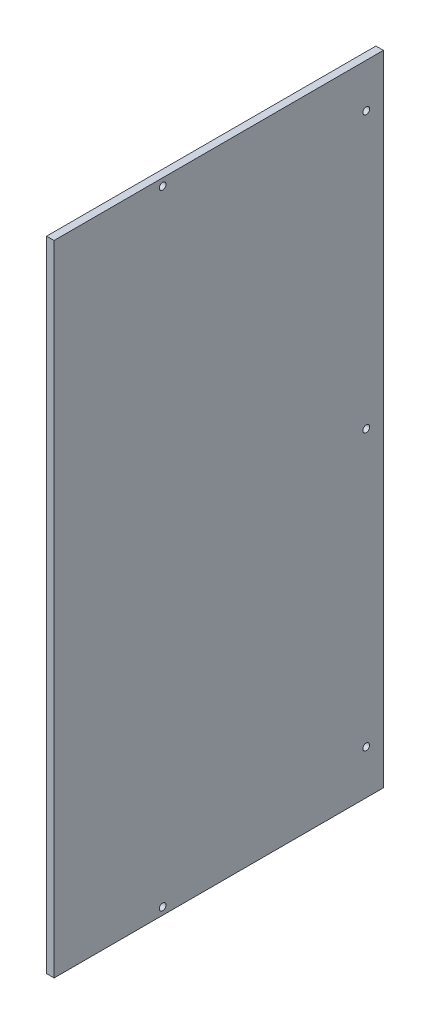
ISO-10303-21;
HEADER;
FILE_DESCRIPTION(('STEP AP214'),'2;1');
FILE_NAME('part.step','',(''),(''),'','','');
FILE_SCHEMA(('AUTOMOTIVE_DESIGN { 1 0 10303 214 1 1 1 1 }'));
ENDSEC;
DATA;
#1=APPLICATION_CONTEXT('core data for automotive mechanical design processes');
#2=APPLICATION_PROTOCOL_DEFINITION('international standard','automotive_design',2000,#1);
#3=PRODUCT_CONTEXT('',#1,'mechanical');
#4=PRODUCT('Part','Part','',(#3));
#5=PRODUCT_RELATED_PRODUCT_CATEGORY('part','',(#4));
#6=PRODUCT_DEFINITION_FORMATION('','',#4);
#7=PRODUCT_DEFINITION_CONTEXT('part definition',#1,'design');
#8=PRODUCT_DEFINITION('design','',#6,#7);
#9=PRODUCT_DEFINITION_SHAPE('','',#8);
#10=(LENGTH_UNIT() NAMED_UNIT(*) SI_UNIT(.MILLI.,.METRE.));
#11=(NAMED_UNIT(*) PLANE_ANGLE_UNIT() SI_UNIT($,.RADIAN.));
#12=(NAMED_UNIT(*) SI_UNIT($,.STERADIAN.) SOLID_ANGLE_UNIT());
#13=UNCERTAINTY_MEASURE_WITH_UNIT(LENGTH_MEASURE(1.E-05),#10,'distance_accuracy_value','');
#14=(GEOMETRIC_REPRESENTATION_CONTEXT(3) GLOBAL_UNCERTAINTY_ASSIGNED_CONTEXT((#13)) GLOBAL_UNIT_ASSIGNED_CONTEXT((#10,
#11,#12)) REPRESENTATION_CONTEXT('',''));
#15=CARTESIAN_POINT('',(0.,0.,0.));
#16=DIRECTION('',(0.,0.,1.));
#17=DIRECTION('',(1.,0.,0.));
#18=AXIS2_PLACEMENT_3D('',#15,#16,#17);
#19=CARTESIAN_POINT('',(4.7625,289.70281124498,66.5086815773984));
#20=DIRECTION('',(0.,0.,-1.));
#21=DIRECTION('',(0.,1.,0.));
#22=AXIS2_PLACEMENT_3D('',#19,#20,#21);
#23=PLANE('',#22);
#24=DIRECTION('',(0.,-1.,0.));
#25=VECTOR('',#24,1.);
#26=CARTESIAN_POINT('',(0.,289.70281124498,66.5086815773984));
#27=LINE('',#26,#25);
#28=CARTESIAN_POINT('',(0.,289.70281124498,66.5086815773984));
#29=VERTEX_POINT('',#28);
#30=CARTESIAN_POINT('',(0.,-116.69718875502,66.5086815773984));
#31=VERTEX_POINT('',#30);
#32=EDGE_CURVE('E97',#29,#31,#27,.T.);
#33=ORIENTED_EDGE('',*,*,#32,.T.);
#34=DIRECTION('',(-1.,0.,0.));
#35=VECTOR('',#34,1.);
#36=CARTESIAN_POINT('',(4.7625,-116.69718875502,66.5086815773984));
#37=LINE('',#36,#35);
#38=CARTESIAN_POINT('',(4.7625,-116.69718875502,66.5086815773984));
#39=VERTEX_POINT('',#38);
#40=EDGE_CURVE('E11',#39,#31,#37,.T.);
#41=ORIENTED_EDGE('',*,*,#40,.F.);
#42=DIRECTION('',(0.,-1.,0.));
#43=VECTOR('',#42,1.);
#44=CARTESIAN_POINT('',(4.7625,289.70281124498,66.5086815773984));
#45=LINE('',#44,#43);
#46=CARTESIAN_POINT('',(4.7625,289.70281124498,66.5086815773984));
#47=VERTEX_POINT('',#46);
#48=EDGE_CURVE('E85',#47,#39,#45,.T.);
#49=ORIENTED_EDGE('',*,*,#48,.F.);
#50=DIRECTION('',(-1.,0.,0.));
#51=VECTOR('',#50,1.);
#52=CARTESIAN_POINT('',(4.7625,289.70281124498,66.5086815773984));
#53=LINE('',#52,#51);
#54=EDGE_CURVE('E93',#47,#29,#53,.T.);
#55=ORIENTED_EDGE('',*,*,#54,.T.);
#56=EDGE_LOOP('',(#33,#41,#49,#55));
#57=FACE_BOUND('',#56,.T.);
#58=ADVANCED_FACE('F34',(#57),#23,.F.);
#59=CARTESIAN_POINT('',(4.7625,-116.69718875502,66.5086815773984));
#60=DIRECTION('',(0.,1.,0.));
#61=DIRECTION('',(0.,0.,1.));
#62=AXIS2_PLACEMENT_3D('',#59,#60,#61);
#63=PLANE('',#62);
#64=DIRECTION('',(0.,0.,-1.));
#65=VECTOR('',#64,1.);
#66=CARTESIAN_POINT('',(0.,-116.69718875502,66.5086815773984));
#67=LINE('',#66,#65);
#68=CARTESIAN_POINT('',(0.,-116.69718875502,-143.041318422602));
#69=VERTEX_POINT('',#68);
#70=EDGE_CURVE('E89',#31,#69,#67,.T.);
#71=ORIENTED_EDGE('',*,*,#70,.T.);
#72=DIRECTION('',(-1.,0.,0.));
#73=VECTOR('',#72,1.);
#74=CARTESIAN_POINT('',(4.7625,-116.69718875502,-143.041318422602));
#75=LINE('',#74,#73);
#76=CARTESIAN_POINT('',(4.7625,-116.69718875502,-143.041318422602));
#77=VERTEX_POINT('',#76);
#78=EDGE_CURVE('E42',#77,#69,#75,.T.);
#79=ORIENTED_EDGE('',*,*,#78,.F.);
#80=DIRECTION('',(0.,0.,-1.));
#81=VECTOR('',#80,1.);
#82=CARTESIAN_POINT('',(4.7625,-116.69718875502,66.5086815773984));
#83=LINE('',#82,#81);
#84=EDGE_CURVE('E80',#39,#77,#83,.T.);
#85=ORIENTED_EDGE('',*,*,#84,.F.);
#86=ORIENTED_EDGE('',*,*,#40,.T.);
#87=EDGE_LOOP('',(#71,#79,#85,#86));
#88=FACE_BOUND('',#87,.T.);
#89=ADVANCED_FACE('F88',(#88),#63,.F.);
#90=CARTESIAN_POINT('',(4.7625,289.70281124498,-143.041318422602));
#91=DIRECTION('',(0.,0.,1.));
#92=DIRECTION('',(1.,0.,0.));
#93=AXIS2_PLACEMENT_3D('',#90,#91,#92);
#94=PLANE('',#93);
#95=DIRECTION('',(0.,1.,0.));
#96=VECTOR('',#95,1.);
#97=CARTESIAN_POINT('',(0.,289.70281124498,-143.041318422602));
#98=LINE('',#97,#96);
#99=CARTESIAN_POINT('',(0.,289.70281124498,-143.041318422602));
#100=VERTEX_POINT('',#99);
#101=EDGE_CURVE('E67',#69,#100,#98,.T.);
#102=ORIENTED_EDGE('',*,*,#101,.T.);
#103=DIRECTION('',(-1.,0.,0.));
#104=VECTOR('',#103,1.);
#105=CARTESIAN_POINT('',(4.7625,289.70281124498,-143.041318422602));
#106=LINE('',#105,#104);
#107=CARTESIAN_POINT('',(4.7625,289.70281124498,-143.041318422602));
#108=VERTEX_POINT('',#107);
#109=EDGE_CURVE('E90',#108,#100,#106,.T.);
#110=ORIENTED_EDGE('',*,*,#109,.F.);
#111=DIRECTION('',(0.,1.,0.));
#112=VECTOR('',#111,1.);
#113=CARTESIAN_POINT('',(4.7625,289.70281124498,-143.041318422602));
#114=LINE('',#113,#112);
#115=EDGE_CURVE('E83',#77,#108,#114,.T.);
#116=ORIENTED_EDGE('',*,*,#115,.F.);
#117=ORIENTED_EDGE('',*,*,#78,.T.);
#118=EDGE_LOOP('',(#102,#110,#116,#117));
#119=FACE_BOUND('',#118,.T.);
#120=ADVANCED_FACE('F91',(#119),#94,.F.);
#121=CARTESIAN_POINT('',(4.7625,289.70281124498,66.5086815773984));
#122=DIRECTION('',(0.,-1.,0.));
#123=DIRECTION('',(0.,0.,-1.));
#124=AXIS2_PLACEMENT_3D('',#121,#122,#123);
#125=PLANE('',#124);
#126=DIRECTION('',(0.,0.,1.));
#127=VECTOR('',#126,1.);
#128=CARTESIAN_POINT('',(0.,289.70281124498,66.5086815773984));
#129=LINE('',#128,#127);
#130=EDGE_CURVE('E73',#100,#29,#129,.T.);
#131=ORIENTED_EDGE('',*,*,#130,.T.);
#132=ORIENTED_EDGE('',*,*,#54,.F.);
#133=DIRECTION('',(0.,0.,1.));
#134=VECTOR('',#133,1.);
#135=CARTESIAN_POINT('',(4.7625,289.70281124498,66.5086815773984));
#136=LINE('',#135,#134);
#137=EDGE_CURVE('E50',#108,#47,#136,.T.);
#138=ORIENTED_EDGE('',*,*,#137,.F.);
#139=ORIENTED_EDGE('',*,*,#109,.T.);
#140=EDGE_LOOP('',(#131,#132,#138,#139));
#141=FACE_BOUND('',#140,.T.);
#142=ADVANCED_FACE('F105',(#141),#125,.F.);
#143=CARTESIAN_POINT('',(4.7625,0.,0.));
#144=DIRECTION('',(1.,0.,0.));
#145=DIRECTION('',(0.,0.,-1.));
#146=AXIS2_PLACEMENT_3D('',#143,#144,#145);
#147=PLANE('',#146);
#148=CARTESIAN_POINT('',(4.7625,-88.6301887550201,-132.119318422602));
#149=DIRECTION('',(-1.,0.,0.));
#150=DIRECTION('',(0.,0.,1.));
#151=AXIS2_PLACEMENT_3D('',#148,#149,#150);
#152=CIRCLE('',#151,2.15265000000001);
#153=CARTESIAN_POINT('',(4.7625,-88.6301887550201,-129.966668422602));
#154=VERTEX_POINT('',#153);
#155=EDGE_CURVE('E134',#154,#154,#152,.T.);
#156=ORIENTED_EDGE('',*,*,#155,.T.);
#157=EDGE_LOOP('',(#156));
#158=FACE_BOUND('',#157,.T.);
#159=CARTESIAN_POINT('',(4.7625,261.88981124498,-132.119318422602));
#160=DIRECTION('',(-1.,0.,0.));
#161=DIRECTION('',(0.,0.,1.));
#162=AXIS2_PLACEMENT_3D('',#159,#160,#161);
#163=CIRCLE('',#162,2.15264999999998);
#164=CARTESIAN_POINT('',(4.7625,261.88981124498,-129.966668422602));
#165=VERTEX_POINT('',#164);
#166=EDGE_CURVE('E128',#165,#165,#163,.T.);
#167=ORIENTED_EDGE('',*,*,#166,.T.);
#168=EDGE_LOOP('',(#167));
#169=FACE_BOUND('',#168,.T.);
#170=CARTESIAN_POINT('',(4.7625,86.6298112449799,-132.119318422602));
#171=DIRECTION('',(-1.,0.,0.));
#172=DIRECTION('',(0.,0.,1.));
#173=AXIS2_PLACEMENT_3D('',#170,#171,#172);
#174=CIRCLE('',#173,2.15265000000001);
#175=CARTESIAN_POINT('',(4.7625,86.6298112449799,-129.966668422602));
#176=VERTEX_POINT('',#175);
#177=EDGE_CURVE('E122',#176,#176,#174,.T.);
#178=ORIENTED_EDGE('',*,*,#177,.T.);
#179=EDGE_LOOP('',(#178));
#180=FACE_BOUND('',#179,.T.);
#181=CARTESIAN_POINT('',(4.7625,-112.06168875502,-2.57931842260164));
#182=DIRECTION('',(-1.,0.,0.));
#183=DIRECTION('',(0.,0.,1.));
#184=AXIS2_PLACEMENT_3D('',#181,#182,#183);
#185=CIRCLE('',#184,2.15265000000001);
#186=CARTESIAN_POINT('',(4.7625,-112.06168875502,-0.426668422601631));
#187=VERTEX_POINT('',#186);
#188=EDGE_CURVE('E116',#187,#187,#185,.T.);
#189=ORIENTED_EDGE('',*,*,#188,.T.);
#190=EDGE_LOOP('',(#189));
#191=FACE_BOUND('',#190,.T.);
#192=CARTESIAN_POINT('',(4.7625,285.06731124498,-2.57931842260164));
#193=DIRECTION('',(-1.,0.,0.));
#194=DIRECTION('',(0.,0.,1.));
#195=AXIS2_PLACEMENT_3D('',#192,#193,#194);
#196=CIRCLE('',#195,2.15264999999998);
#197=CARTESIAN_POINT('',(4.7625,285.06731124498,-0.426668422601658));
#198=VERTEX_POINT('',#197);
#199=EDGE_CURVE('E100',#198,#198,#196,.T.);
#200=ORIENTED_EDGE('',*,*,#199,.T.);
#201=EDGE_LOOP('',(#200));
#202=FACE_BOUND('',#201,.T.);
#203=ORIENTED_EDGE('',*,*,#48,.T.);
#204=ORIENTED_EDGE('',*,*,#84,.T.);
#205=ORIENTED_EDGE('',*,*,#115,.T.);
#206=ORIENTED_EDGE('',*,*,#137,.T.);
#207=EDGE_LOOP('',(#203,#204,#205,#206));
#208=FACE_BOUND('',#207,.T.);
#209=ADVANCED_FACE('F81',(#158,#169,#180,#191,#202,#208),#147,.T.);
#210=CARTESIAN_POINT('',(0.,0.,0.));
#211=DIRECTION('',(1.,0.,0.));
#212=DIRECTION('',(0.,0.,-1.));
#213=AXIS2_PLACEMENT_3D('',#210,#211,#212);
#214=PLANE('',#213);
#215=CARTESIAN_POINT('',(0.,-88.6301887550201,-132.119318422602));
#216=DIRECTION('',(-1.,0.,0.));
#217=DIRECTION('',(0.,0.,1.));
#218=AXIS2_PLACEMENT_3D('',#215,#216,#217);
#219=CIRCLE('',#218,2.15264999999999);
#220=CARTESIAN_POINT('',(0.,-88.6301887550201,-129.966668422602));
#221=VERTEX_POINT('',#220);
#222=EDGE_CURVE('E137',#221,#221,#219,.T.);
#223=ORIENTED_EDGE('',*,*,#222,.F.);
#224=EDGE_LOOP('',(#223));
#225=FACE_BOUND('',#224,.T.);
#226=CARTESIAN_POINT('',(0.,261.88981124498,-132.119318422602));
#227=DIRECTION('',(-1.,0.,0.));
#228=DIRECTION('',(0.,0.,1.));
#229=AXIS2_PLACEMENT_3D('',#226,#227,#228);
#230=CIRCLE('',#229,2.15264999999998);
#231=CARTESIAN_POINT('',(0.,261.88981124498,-129.966668422602));
#232=VERTEX_POINT('',#231);
#233=EDGE_CURVE('E131',#232,#232,#230,.T.);
#234=ORIENTED_EDGE('',*,*,#233,.F.);
#235=EDGE_LOOP('',(#234));
#236=FACE_BOUND('',#235,.T.);
#237=CARTESIAN_POINT('',(0.,86.6298112449799,-132.119318422602));
#238=DIRECTION('',(-1.,0.,0.));
#239=DIRECTION('',(0.,0.,1.));
#240=AXIS2_PLACEMENT_3D('',#237,#238,#239);
#241=CIRCLE('',#240,2.15264999999999);
#242=CARTESIAN_POINT('',(0.,86.6298112449799,-129.966668422602));
#243=VERTEX_POINT('',#242);
#244=EDGE_CURVE('E125',#243,#243,#241,.T.);
#245=ORIENTED_EDGE('',*,*,#244,.F.);
#246=EDGE_LOOP('',(#245));
#247=FACE_BOUND('',#246,.T.);
#248=CARTESIAN_POINT('',(0.,-112.06168875502,-2.57931842260164));
#249=DIRECTION('',(-1.,0.,0.));
#250=DIRECTION('',(0.,0.,1.));
#251=AXIS2_PLACEMENT_3D('',#248,#249,#250);
#252=CIRCLE('',#251,2.15264999999999);
#253=CARTESIAN_POINT('',(0.,-112.06168875502,-0.426668422601645));
#254=VERTEX_POINT('',#253);
#255=EDGE_CURVE('E119',#254,#254,#252,.T.);
#256=ORIENTED_EDGE('',*,*,#255,.F.);
#257=EDGE_LOOP('',(#256));
#258=FACE_BOUND('',#257,.T.);
#259=CARTESIAN_POINT('',(0.,285.06731124498,-2.57931842260164));
#260=DIRECTION('',(-1.,0.,0.));
#261=DIRECTION('',(0.,0.,1.));
#262=AXIS2_PLACEMENT_3D('',#259,#260,#261);
#263=CIRCLE('',#262,2.15264999999998);
#264=CARTESIAN_POINT('',(0.,285.06731124498,-0.426668422601658));
#265=VERTEX_POINT('',#264);
#266=EDGE_CURVE('E113',#265,#265,#263,.T.);
#267=ORIENTED_EDGE('',*,*,#266,.F.);
#268=EDGE_LOOP('',(#267));
#269=FACE_BOUND('',#268,.T.);
#270=ORIENTED_EDGE('',*,*,#32,.F.);
#271=ORIENTED_EDGE('',*,*,#130,.F.);
#272=ORIENTED_EDGE('',*,*,#101,.F.);
#273=ORIENTED_EDGE('',*,*,#70,.F.);
#274=EDGE_LOOP('',(#270,#271,#272,#273));
#275=FACE_BOUND('',#274,.T.);
#276=ADVANCED_FACE('F108',(#225,#236,#247,#258,#269,#275),#214,.F.);
#277=CARTESIAN_POINT('',(0.,285.06731124498,-2.57931842260164));
#278=DIRECTION('',(-1.,0.,0.));
#279=DIRECTION('',(0.,0.,1.));
#280=AXIS2_PLACEMENT_3D('',#277,#278,#279);
#281=CYLINDRICAL_SURFACE('',#280,2.15264999999998);
#282=ORIENTED_EDGE('',*,*,#199,.F.);
#283=EDGE_LOOP('',(#282));
#284=FACE_BOUND('',#283,.T.);
#285=ORIENTED_EDGE('',*,*,#266,.T.);
#286=EDGE_LOOP('',(#285));
#287=FACE_BOUND('',#286,.T.);
#288=ADVANCED_FACE('F145',(#284,#287),#281,.F.);
#289=CARTESIAN_POINT('',(0.,-112.06168875502,-2.57931842260164));
#290=DIRECTION('',(-1.,0.,0.));
#291=DIRECTION('',(0.,0.,1.));
#292=AXIS2_PLACEMENT_3D('',#289,#290,#291);
#293=CYLINDRICAL_SURFACE('',#292,2.15265);
#294=ORIENTED_EDGE('',*,*,#188,.F.);
#295=EDGE_LOOP('',(#294));
#296=FACE_BOUND('',#295,.T.);
#297=ORIENTED_EDGE('',*,*,#255,.T.);
#298=EDGE_LOOP('',(#297));
#299=FACE_BOUND('',#298,.T.);
#300=ADVANCED_FACE('F156',(#296,#299),#293,.F.);
#301=CARTESIAN_POINT('',(0.,86.6298112449799,-132.119318422602));
#302=DIRECTION('',(-1.,0.,0.));
#303=DIRECTION('',(0.,0.,1.));
#304=AXIS2_PLACEMENT_3D('',#301,#302,#303);
#305=CYLINDRICAL_SURFACE('',#304,2.15265);
#306=ORIENTED_EDGE('',*,*,#177,.F.);
#307=EDGE_LOOP('',(#306));
#308=FACE_BOUND('',#307,.T.);
#309=ORIENTED_EDGE('',*,*,#244,.T.);
#310=EDGE_LOOP('',(#309));
#311=FACE_BOUND('',#310,.T.);
#312=ADVANCED_FACE('F162',(#308,#311),#305,.F.);
#313=CARTESIAN_POINT('',(0.,261.88981124498,-132.119318422602));
#314=DIRECTION('',(-1.,0.,0.));
#315=DIRECTION('',(0.,0.,1.));
#316=AXIS2_PLACEMENT_3D('',#313,#314,#315);
#317=CYLINDRICAL_SURFACE('',#316,2.15264999999998);
#318=ORIENTED_EDGE('',*,*,#166,.F.);
#319=EDGE_LOOP('',(#318));
#320=FACE_BOUND('',#319,.T.);
#321=ORIENTED_EDGE('',*,*,#233,.T.);
#322=EDGE_LOOP('',(#321));
#323=FACE_BOUND('',#322,.T.);
#324=ADVANCED_FACE('F193',(#320,#323),#317,.F.);
#325=CARTESIAN_POINT('',(0.,-88.6301887550201,-132.119318422602));
#326=DIRECTION('',(-1.,0.,0.));
#327=DIRECTION('',(0.,0.,1.));
#328=AXIS2_PLACEMENT_3D('',#325,#326,#327);
#329=CYLINDRICAL_SURFACE('',#328,2.15265);
#330=ORIENTED_EDGE('',*,*,#155,.F.);
#331=EDGE_LOOP('',(#330));
#332=FACE_BOUND('',#331,.T.);
#333=ORIENTED_EDGE('',*,*,#222,.T.);
#334=EDGE_LOOP('',(#333));
#335=FACE_BOUND('',#334,.T.);
#336=ADVANCED_FACE('F141',(#332,#335),#329,.F.);
#337=CLOSED_SHELL('',(#58,#89,#120,#142,#209,#276,#288,#300,#312,#324,#336));
#338=MANIFOLD_SOLID_BREP('B2',#337);
#339=ADVANCED_BREP_SHAPE_REPRESENTATION('',(#18,#338),#14);
#340=SHAPE_DEFINITION_REPRESENTATION(#9,#339);
ENDSEC;
END-ISO-10303-21;
